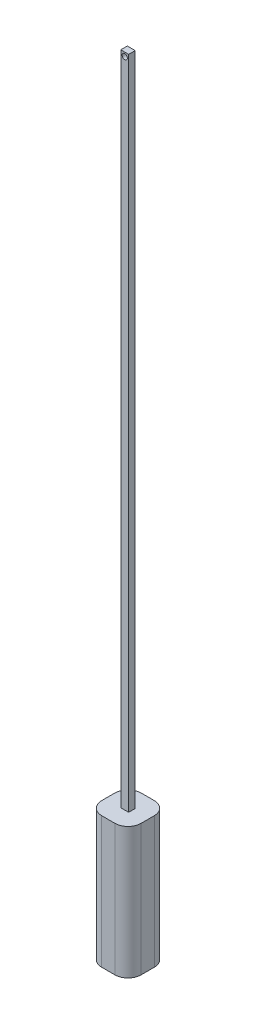
ISO-10303-21;
HEADER;
FILE_DESCRIPTION(('STEP AP214'),'2;1');
FILE_NAME('part.step','',(''),(''),'','','');
FILE_SCHEMA(('AUTOMOTIVE_DESIGN { 1 0 10303 214 1 1 1 1 }'));
ENDSEC;
DATA;
#1=APPLICATION_CONTEXT('core data for automotive mechanical design processes');
#2=APPLICATION_PROTOCOL_DEFINITION('international standard','automotive_design',2000,#1);
#3=PRODUCT_CONTEXT('',#1,'mechanical');
#4=PRODUCT('Part','Part','',(#3));
#5=PRODUCT_RELATED_PRODUCT_CATEGORY('part','',(#4));
#6=PRODUCT_DEFINITION_FORMATION('','',#4);
#7=PRODUCT_DEFINITION_CONTEXT('part definition',#1,'design');
#8=PRODUCT_DEFINITION('design','',#6,#7);
#9=PRODUCT_DEFINITION_SHAPE('','',#8);
#10=(LENGTH_UNIT() NAMED_UNIT(*) SI_UNIT(.MILLI.,.METRE.));
#11=(NAMED_UNIT(*) PLANE_ANGLE_UNIT() SI_UNIT($,.RADIAN.));
#12=(NAMED_UNIT(*) SI_UNIT($,.STERADIAN.) SOLID_ANGLE_UNIT());
#13=UNCERTAINTY_MEASURE_WITH_UNIT(LENGTH_MEASURE(1.E-05),#10,'distance_accuracy_value','');
#14=(GEOMETRIC_REPRESENTATION_CONTEXT(3) GLOBAL_UNCERTAINTY_ASSIGNED_CONTEXT((#13)) GLOBAL_UNIT_ASSIGNED_CONTEXT((#10,
#11,#12)) REPRESENTATION_CONTEXT('',''));
#15=CARTESIAN_POINT('',(0.,0.,0.));
#16=DIRECTION('',(0.,0.,1.));
#17=DIRECTION('',(1.,0.,0.));
#18=AXIS2_PLACEMENT_3D('',#15,#16,#17);
#19=CARTESIAN_POINT('',(0.,0.,5.));
#20=DIRECTION('',(0.,0.,1.));
#21=DIRECTION('',(1.,0.,0.));
#22=AXIS2_PLACEMENT_3D('',#19,#20,#21);
#23=PLANE('',#22);
#24=DIRECTION('',(0.,-1.,0.));
#25=VECTOR('',#24,1.);
#26=CARTESIAN_POINT('',(-3.,3.,5.));
#27=LINE('',#26,#25);
#28=CARTESIAN_POINT('',(-3.,3.,5.));
#29=VERTEX_POINT('',#28);
#30=CARTESIAN_POINT('',(-3.,-497.,5.));
#31=VERTEX_POINT('',#30);
#32=EDGE_CURVE('E141',#29,#31,#27,.T.);
#33=ORIENTED_EDGE('',*,*,#32,.T.);
#34=DIRECTION('',(1.,0.,0.));
#35=VECTOR('',#34,1.);
#36=CARTESIAN_POINT('',(-2.99999999999994,-497.,5.));
#37=LINE('',#36,#35);
#38=CARTESIAN_POINT('',(3.00000000000006,-497.,5.));
#39=VERTEX_POINT('',#38);
#40=EDGE_CURVE('E126',#31,#39,#37,.T.);
#41=ORIENTED_EDGE('',*,*,#40,.T.);
#42=DIRECTION('',(0.,1.,0.));
#43=VECTOR('',#42,1.);
#44=CARTESIAN_POINT('',(3.,3.,5.));
#45=LINE('',#44,#43);
#46=CARTESIAN_POINT('',(3.,3.,5.));
#47=VERTEX_POINT('',#46);
#48=EDGE_CURVE('E138',#39,#47,#45,.T.);
#49=ORIENTED_EDGE('',*,*,#48,.T.);
#50=DIRECTION('',(-1.,0.,0.));
#51=VECTOR('',#50,1.);
#52=CARTESIAN_POINT('',(-3.,3.,5.));
#53=LINE('',#52,#51);
#54=EDGE_CURVE('E147',#47,#29,#53,.T.);
#55=ORIENTED_EDGE('',*,*,#54,.T.);
#56=EDGE_LOOP('',(#33,#41,#49,#55));
#57=FACE_BOUND('',#56,.T.);
#58=CARTESIAN_POINT('',(0.,0.,5.));
#59=DIRECTION('',(0.,0.,1.));
#60=DIRECTION('',(1.,0.,0.));
#61=AXIS2_PLACEMENT_3D('',#58,#59,#60);
#62=CIRCLE('',#61,2.);
#63=CARTESIAN_POINT('',(2.,0.,5.));
#64=VERTEX_POINT('',#63);
#65=EDGE_CURVE('E156',#64,#64,#62,.T.);
#66=ORIENTED_EDGE('',*,*,#65,.F.);
#67=EDGE_LOOP('',(#66));
#68=FACE_BOUND('',#67,.T.);
#69=ADVANCED_FACE('F34',(#57,#68),#23,.T.);
#70=CARTESIAN_POINT('',(0.,0.,0.));
#71=DIRECTION('',(0.,0.,1.));
#72=DIRECTION('',(1.,0.,0.));
#73=AXIS2_PLACEMENT_3D('',#70,#71,#72);
#74=PLANE('',#73);
#75=DIRECTION('',(0.,-1.,0.));
#76=VECTOR('',#75,1.);
#77=CARTESIAN_POINT('',(-3.,3.,0.));
#78=LINE('',#77,#76);
#79=CARTESIAN_POINT('',(-3.,3.,0.));
#80=VERTEX_POINT('',#79);
#81=CARTESIAN_POINT('',(-3.,-497.,0.));
#82=VERTEX_POINT('',#81);
#83=EDGE_CURVE('E153',#80,#82,#78,.T.);
#84=ORIENTED_EDGE('',*,*,#83,.F.);
#85=DIRECTION('',(-1.,0.,0.));
#86=VECTOR('',#85,1.);
#87=CARTESIAN_POINT('',(-3.,3.,0.));
#88=LINE('',#87,#86);
#89=CARTESIAN_POINT('',(3.,3.,0.));
#90=VERTEX_POINT('',#89);
#91=EDGE_CURVE('E160',#90,#80,#88,.T.);
#92=ORIENTED_EDGE('',*,*,#91,.F.);
#93=DIRECTION('',(0.,1.,0.));
#94=VECTOR('',#93,1.);
#95=CARTESIAN_POINT('',(3.,3.,0.));
#96=LINE('',#95,#94);
#97=CARTESIAN_POINT('',(3.00000000000006,-497.,0.));
#98=VERTEX_POINT('',#97);
#99=EDGE_CURVE('E158',#98,#90,#96,.T.);
#100=ORIENTED_EDGE('',*,*,#99,.F.);
#101=DIRECTION('',(1.,0.,0.));
#102=VECTOR('',#101,1.);
#103=CARTESIAN_POINT('',(-2.99999999999994,-497.,0.));
#104=LINE('',#103,#102);
#105=EDGE_CURVE('E129',#82,#98,#104,.T.);
#106=ORIENTED_EDGE('',*,*,#105,.F.);
#107=EDGE_LOOP('',(#84,#92,#100,#106));
#108=FACE_BOUND('',#107,.T.);
#109=CARTESIAN_POINT('',(0.,0.,0.));
#110=DIRECTION('',(0.,0.,1.));
#111=DIRECTION('',(1.,0.,0.));
#112=AXIS2_PLACEMENT_3D('',#109,#110,#111);
#113=CIRCLE('',#112,2.);
#114=CARTESIAN_POINT('',(2.,0.,0.));
#115=VERTEX_POINT('',#114);
#116=EDGE_CURVE('E224',#115,#115,#113,.T.);
#117=ORIENTED_EDGE('',*,*,#116,.T.);
#118=EDGE_LOOP('',(#117));
#119=FACE_BOUND('',#118,.T.);
#120=ADVANCED_FACE('F264',(#108,#119),#74,.F.);
#121=CARTESIAN_POINT('',(-3.,3.,5.));
#122=DIRECTION('',(1.,0.,0.));
#123=DIRECTION('',(0.,1.,0.));
#124=AXIS2_PLACEMENT_3D('',#121,#122,#123);
#125=PLANE('',#124);
#126=ORIENTED_EDGE('',*,*,#83,.T.);
#127=DIRECTION('',(0.,0.,-1.));
#128=VECTOR('',#127,1.);
#129=CARTESIAN_POINT('',(-2.99999999999994,-497.,5.));
#130=LINE('',#129,#128);
#131=EDGE_CURVE('E133',#31,#82,#130,.T.);
#132=ORIENTED_EDGE('',*,*,#131,.F.);
#133=ORIENTED_EDGE('',*,*,#32,.F.);
#134=DIRECTION('',(0.,0.,-1.));
#135=VECTOR('',#134,1.);
#136=CARTESIAN_POINT('',(-3.,3.,5.));
#137=LINE('',#136,#135);
#138=EDGE_CURVE('E149',#29,#80,#137,.T.);
#139=ORIENTED_EDGE('',*,*,#138,.T.);
#140=EDGE_LOOP('',(#126,#132,#133,#139));
#141=FACE_BOUND('',#140,.T.);
#142=ADVANCED_FACE('F269',(#141),#125,.F.);
#143=CARTESIAN_POINT('',(3.,3.,5.));
#144=DIRECTION('',(-1.,0.,0.));
#145=DIRECTION('',(0.,-1.,0.));
#146=AXIS2_PLACEMENT_3D('',#143,#144,#145);
#147=PLANE('',#146);
#148=ORIENTED_EDGE('',*,*,#99,.T.);
#149=DIRECTION('',(0.,0.,-1.));
#150=VECTOR('',#149,1.);
#151=CARTESIAN_POINT('',(3.,3.,5.));
#152=LINE('',#151,#150);
#153=EDGE_CURVE('E134',#47,#90,#152,.T.);
#154=ORIENTED_EDGE('',*,*,#153,.F.);
#155=ORIENTED_EDGE('',*,*,#48,.F.);
#156=DIRECTION('',(0.,0.,-1.));
#157=VECTOR('',#156,1.);
#158=CARTESIAN_POINT('',(3.00000000000006,-497.,5.));
#159=LINE('',#158,#157);
#160=EDGE_CURVE('E123',#39,#98,#159,.T.);
#161=ORIENTED_EDGE('',*,*,#160,.T.);
#162=EDGE_LOOP('',(#148,#154,#155,#161));
#163=FACE_BOUND('',#162,.T.);
#164=ADVANCED_FACE('F144',(#163),#147,.F.);
#165=CARTESIAN_POINT('',(-3.,3.,5.));
#166=DIRECTION('',(0.,-1.,0.));
#167=DIRECTION('',(1.,0.,0.));
#168=AXIS2_PLACEMENT_3D('',#165,#166,#167);
#169=PLANE('',#168);
#170=ORIENTED_EDGE('',*,*,#91,.T.);
#171=ORIENTED_EDGE('',*,*,#138,.F.);
#172=ORIENTED_EDGE('',*,*,#54,.F.);
#173=ORIENTED_EDGE('',*,*,#153,.T.);
#174=EDGE_LOOP('',(#170,#171,#172,#173));
#175=FACE_BOUND('',#174,.T.);
#176=ADVANCED_FACE('F276',(#175),#169,.F.);
#177=CARTESIAN_POINT('',(0.,0.,5.));
#178=DIRECTION('',(0.,0.,-1.));
#179=DIRECTION('',(-1.,0.,0.));
#180=AXIS2_PLACEMENT_3D('',#177,#178,#179);
#181=CYLINDRICAL_SURFACE('',#180,2.);
#182=ORIENTED_EDGE('',*,*,#65,.T.);
#183=EDGE_LOOP('',(#182));
#184=FACE_BOUND('',#183,.T.);
#185=ORIENTED_EDGE('',*,*,#116,.F.);
#186=EDGE_LOOP('',(#185));
#187=FACE_BOUND('',#186,.T.);
#188=ADVANCED_FACE('F273',(#184,#187),#181,.F.);
#189=CARTESIAN_POINT('',(0.,-497.,0.));
#190=DIRECTION('',(0.,-1.,0.));
#191=DIRECTION('',(0.,0.,-1.));
#192=AXIS2_PLACEMENT_3D('',#189,#190,#191);
#193=PLANE('',#192);
#194=DIRECTION('',(1.,0.,0.));
#195=VECTOR('',#194,1.);
#196=CARTESIAN_POINT('',(-14.9999999999999,-497.,-12.5));
#197=LINE('',#196,#195);
#198=CARTESIAN_POINT('',(-4.99999999999994,-497.,-12.5));
#199=VERTEX_POINT('',#198);
#200=CARTESIAN_POINT('',(5.00000000000006,-497.,-12.5));
#201=VERTEX_POINT('',#200);
#202=EDGE_CURVE('E220',#199,#201,#197,.T.);
#203=ORIENTED_EDGE('',*,*,#202,.F.);
#204=CARTESIAN_POINT('',(-4.99999999999994,-497.,-2.5));
#205=DIRECTION('',(0.,-1.,0.));
#206=DIRECTION('',(0.,0.,-1.));
#207=AXIS2_PLACEMENT_3D('',#204,#205,#206);
#208=CIRCLE('',#207,10.);
#209=CARTESIAN_POINT('',(-14.9999999999999,-497.,-2.5));
#210=VERTEX_POINT('',#209);
#211=EDGE_CURVE('E177',#199,#210,#208,.F.);
#212=ORIENTED_EDGE('',*,*,#211,.T.);
#213=DIRECTION('',(0.,0.,-1.));
#214=VECTOR('',#213,1.);
#215=CARTESIAN_POINT('',(-14.9999999999999,-497.,17.5));
#216=LINE('',#215,#214);
#217=CARTESIAN_POINT('',(-14.9999999999999,-497.,7.5));
#218=VERTEX_POINT('',#217);
#219=EDGE_CURVE('E212',#218,#210,#216,.T.);
#220=ORIENTED_EDGE('',*,*,#219,.F.);
#221=CARTESIAN_POINT('',(-4.99999999999994,-497.,7.49999999999999));
#222=DIRECTION('',(0.,-1.,0.));
#223=DIRECTION('',(0.,0.,-1.));
#224=AXIS2_PLACEMENT_3D('',#221,#222,#223);
#225=CIRCLE('',#224,10.);
#226=CARTESIAN_POINT('',(-4.99999999999994,-497.,17.5));
#227=VERTEX_POINT('',#226);
#228=EDGE_CURVE('E171',#218,#227,#225,.F.);
#229=ORIENTED_EDGE('',*,*,#228,.T.);
#230=DIRECTION('',(-1.,0.,0.));
#231=VECTOR('',#230,1.);
#232=CARTESIAN_POINT('',(-14.9999999999999,-497.,17.5));
#233=LINE('',#232,#231);
#234=CARTESIAN_POINT('',(5.00000000000006,-497.,17.5));
#235=VERTEX_POINT('',#234);
#236=EDGE_CURVE('E210',#235,#227,#233,.T.);
#237=ORIENTED_EDGE('',*,*,#236,.F.);
#238=CARTESIAN_POINT('',(5.00000000000006,-497.,7.49999999999999));
#239=DIRECTION('',(0.,-1.,0.));
#240=DIRECTION('',(0.,0.,-1.));
#241=AXIS2_PLACEMENT_3D('',#238,#239,#240);
#242=CIRCLE('',#241,10.);
#243=CARTESIAN_POINT('',(15.0000000000001,-497.,7.5));
#244=VERTEX_POINT('',#243);
#245=EDGE_CURVE('E173',#235,#244,#242,.F.);
#246=ORIENTED_EDGE('',*,*,#245,.T.);
#247=DIRECTION('',(0.,0.,1.));
#248=VECTOR('',#247,1.);
#249=CARTESIAN_POINT('',(15.0000000000001,-497.,17.5));
#250=LINE('',#249,#248);
#251=CARTESIAN_POINT('',(15.0000000000001,-497.,-2.5));
#252=VERTEX_POINT('',#251);
#253=EDGE_CURVE('E201',#252,#244,#250,.T.);
#254=ORIENTED_EDGE('',*,*,#253,.F.);
#255=CARTESIAN_POINT('',(5.00000000000006,-497.,-2.5));
#256=DIRECTION('',(0.,-1.,0.));
#257=DIRECTION('',(0.,0.,-1.));
#258=AXIS2_PLACEMENT_3D('',#255,#256,#257);
#259=CIRCLE('',#258,10.);
#260=EDGE_CURVE('E175',#252,#201,#259,.F.);
#261=ORIENTED_EDGE('',*,*,#260,.T.);
#262=EDGE_LOOP('',(#203,#212,#220,#229,#237,#246,#254,#261));
#263=FACE_BOUND('',#262,.T.);
#264=ORIENTED_EDGE('',*,*,#40,.F.);
#265=ORIENTED_EDGE('',*,*,#131,.T.);
#266=ORIENTED_EDGE('',*,*,#105,.T.);
#267=ORIENTED_EDGE('',*,*,#160,.F.);
#268=EDGE_LOOP('',(#264,#265,#266,#267));
#269=FACE_BOUND('',#268,.T.);
#270=ADVANCED_FACE('F125',(#263,#269),#193,.F.);
#271=CARTESIAN_POINT('',(15.0000000000001,-597.,17.5));
#272=DIRECTION('',(-1.,0.,0.));
#273=DIRECTION('',(0.,0.,1.));
#274=AXIS2_PLACEMENT_3D('',#271,#272,#273);
#275=PLANE('',#274);
#276=DIRECTION('',(0.,0.,1.));
#277=VECTOR('',#276,1.);
#278=CARTESIAN_POINT('',(15.0000000000001,-597.,17.5));
#279=LINE('',#278,#277);
#280=CARTESIAN_POINT('',(15.0000000000001,-597.,-2.5));
#281=VERTEX_POINT('',#280);
#282=CARTESIAN_POINT('',(15.0000000000001,-597.,7.5));
#283=VERTEX_POINT('',#282);
#284=EDGE_CURVE('E203',#281,#283,#279,.T.);
#285=ORIENTED_EDGE('',*,*,#284,.F.);
#286=DIRECTION('',(0.,1.,0.));
#287=VECTOR('',#286,1.);
#288=CARTESIAN_POINT('',(15.0000000000001,-597.,-2.5));
#289=LINE('',#288,#287);
#290=EDGE_CURVE('E193',#281,#252,#289,.T.);
#291=ORIENTED_EDGE('',*,*,#290,.T.);
#292=ORIENTED_EDGE('',*,*,#253,.T.);
#293=DIRECTION('',(0.,1.,0.));
#294=VECTOR('',#293,1.);
#295=CARTESIAN_POINT('',(15.0000000000001,-597.,7.5));
#296=LINE('',#295,#294);
#297=EDGE_CURVE('E191',#244,#283,#296,.F.);
#298=ORIENTED_EDGE('',*,*,#297,.T.);
#299=EDGE_LOOP('',(#285,#291,#292,#298));
#300=FACE_BOUND('',#299,.T.);
#301=ADVANCED_FACE('F200',(#300),#275,.F.);
#302=CARTESIAN_POINT('',(-14.9999999999999,-597.,17.5));
#303=DIRECTION('',(0.,0.,-1.));
#304=DIRECTION('',(-1.,0.,0.));
#305=AXIS2_PLACEMENT_3D('',#302,#303,#304);
#306=PLANE('',#305);
#307=DIRECTION('',(-1.,0.,0.));
#308=VECTOR('',#307,1.);
#309=CARTESIAN_POINT('',(-14.9999999999999,-597.,17.5));
#310=LINE('',#309,#308);
#311=CARTESIAN_POINT('',(5.00000000000006,-597.,17.5));
#312=VERTEX_POINT('',#311);
#313=CARTESIAN_POINT('',(-4.99999999999994,-597.,17.5));
#314=VERTEX_POINT('',#313);
#315=EDGE_CURVE('E232',#312,#314,#310,.T.);
#316=ORIENTED_EDGE('',*,*,#315,.F.);
#317=DIRECTION('',(0.,1.,0.));
#318=VECTOR('',#317,1.);
#319=CARTESIAN_POINT('',(5.00000000000006,-597.,17.5));
#320=LINE('',#319,#318);
#321=EDGE_CURVE('E11',#312,#235,#320,.T.);
#322=ORIENTED_EDGE('',*,*,#321,.T.);
#323=ORIENTED_EDGE('',*,*,#236,.T.);
#324=DIRECTION('',(0.,1.,0.));
#325=VECTOR('',#324,1.);
#326=CARTESIAN_POINT('',(-4.99999999999994,-597.,17.5));
#327=LINE('',#326,#325);
#328=EDGE_CURVE('E42',#227,#314,#327,.F.);
#329=ORIENTED_EDGE('',*,*,#328,.T.);
#330=EDGE_LOOP('',(#316,#322,#323,#329));
#331=FACE_BOUND('',#330,.T.);
#332=ADVANCED_FACE('F241',(#331),#306,.F.);
#333=CARTESIAN_POINT('',(-14.9999999999999,-597.,17.5));
#334=DIRECTION('',(1.,0.,0.));
#335=DIRECTION('',(0.,0.,-1.));
#336=AXIS2_PLACEMENT_3D('',#333,#334,#335);
#337=PLANE('',#336);
#338=ORIENTED_EDGE('',*,*,#219,.T.);
#339=DIRECTION('',(0.,1.,0.));
#340=VECTOR('',#339,1.);
#341=CARTESIAN_POINT('',(-14.9999999999999,-597.,-2.5));
#342=LINE('',#341,#340);
#343=CARTESIAN_POINT('',(-14.9999999999999,-597.,-2.5));
#344=VERTEX_POINT('',#343);
#345=EDGE_CURVE('E182',#210,#344,#342,.F.);
#346=ORIENTED_EDGE('',*,*,#345,.T.);
#347=DIRECTION('',(0.,0.,-1.));
#348=VECTOR('',#347,1.);
#349=CARTESIAN_POINT('',(-14.9999999999999,-597.,17.5));
#350=LINE('',#349,#348);
#351=CARTESIAN_POINT('',(-14.9999999999999,-597.,7.5));
#352=VERTEX_POINT('',#351);
#353=EDGE_CURVE('E229',#352,#344,#350,.T.);
#354=ORIENTED_EDGE('',*,*,#353,.F.);
#355=DIRECTION('',(0.,1.,0.));
#356=VECTOR('',#355,1.);
#357=CARTESIAN_POINT('',(-14.9999999999999,-597.,7.49999999999999));
#358=LINE('',#357,#356);
#359=EDGE_CURVE('E179',#352,#218,#358,.T.);
#360=ORIENTED_EDGE('',*,*,#359,.T.);
#361=EDGE_LOOP('',(#338,#346,#354,#360));
#362=FACE_BOUND('',#361,.T.);
#363=ADVANCED_FACE('F247',(#362),#337,.F.);
#364=CARTESIAN_POINT('',(-14.9999999999999,-597.,-12.5));
#365=DIRECTION('',(0.,0.,1.));
#366=DIRECTION('',(1.,0.,0.));
#367=AXIS2_PLACEMENT_3D('',#364,#365,#366);
#368=PLANE('',#367);
#369=DIRECTION('',(1.,0.,0.));
#370=VECTOR('',#369,1.);
#371=CARTESIAN_POINT('',(-14.9999999999999,-597.,-12.5));
#372=LINE('',#371,#370);
#373=CARTESIAN_POINT('',(-4.99999999999994,-597.,-12.5));
#374=VERTEX_POINT('',#373);
#375=CARTESIAN_POINT('',(5.00000000000006,-597.,-12.5));
#376=VERTEX_POINT('',#375);
#377=EDGE_CURVE('E215',#374,#376,#372,.T.);
#378=ORIENTED_EDGE('',*,*,#377,.F.);
#379=DIRECTION('',(0.,1.,0.));
#380=VECTOR('',#379,1.);
#381=CARTESIAN_POINT('',(-4.99999999999994,-597.,-12.5));
#382=LINE('',#381,#380);
#383=EDGE_CURVE('E168',#374,#199,#382,.T.);
#384=ORIENTED_EDGE('',*,*,#383,.T.);
#385=ORIENTED_EDGE('',*,*,#202,.T.);
#386=DIRECTION('',(0.,1.,0.));
#387=VECTOR('',#386,1.);
#388=CARTESIAN_POINT('',(5.00000000000006,-597.,-12.5));
#389=LINE('',#388,#387);
#390=EDGE_CURVE('E166',#201,#376,#389,.F.);
#391=ORIENTED_EDGE('',*,*,#390,.T.);
#392=EDGE_LOOP('',(#378,#384,#385,#391));
#393=FACE_BOUND('',#392,.T.);
#394=ADVANCED_FACE('F253',(#393),#368,.F.);
#395=CARTESIAN_POINT('',(0.,-597.,0.));
#396=DIRECTION('',(0.,-1.,0.));
#397=DIRECTION('',(0.,0.,-1.));
#398=AXIS2_PLACEMENT_3D('',#395,#396,#397);
#399=PLANE('',#398);
#400=ORIENTED_EDGE('',*,*,#353,.T.);
#401=CARTESIAN_POINT('',(-4.99999999999994,-597.,-2.5));
#402=DIRECTION('',(0.,-1.,0.));
#403=DIRECTION('',(0.,0.,-1.));
#404=AXIS2_PLACEMENT_3D('',#401,#402,#403);
#405=CIRCLE('',#404,10.);
#406=EDGE_CURVE('E189',#344,#374,#405,.T.);
#407=ORIENTED_EDGE('',*,*,#406,.T.);
#408=ORIENTED_EDGE('',*,*,#377,.T.);
#409=CARTESIAN_POINT('',(5.00000000000006,-597.,-2.5));
#410=DIRECTION('',(0.,-1.,0.));
#411=DIRECTION('',(0.,0.,-1.));
#412=AXIS2_PLACEMENT_3D('',#409,#410,#411);
#413=CIRCLE('',#412,10.);
#414=EDGE_CURVE('E187',#376,#281,#413,.T.);
#415=ORIENTED_EDGE('',*,*,#414,.T.);
#416=ORIENTED_EDGE('',*,*,#284,.T.);
#417=CARTESIAN_POINT('',(5.00000000000006,-597.,7.49999999999999));
#418=DIRECTION('',(0.,-1.,0.));
#419=DIRECTION('',(0.,0.,-1.));
#420=AXIS2_PLACEMENT_3D('',#417,#418,#419);
#421=CIRCLE('',#420,10.);
#422=EDGE_CURVE('E55',#283,#312,#421,.T.);
#423=ORIENTED_EDGE('',*,*,#422,.T.);
#424=ORIENTED_EDGE('',*,*,#315,.T.);
#425=CARTESIAN_POINT('',(-4.99999999999994,-597.,7.49999999999999));
#426=DIRECTION('',(0.,-1.,0.));
#427=DIRECTION('',(0.,0.,-1.));
#428=AXIS2_PLACEMENT_3D('',#425,#426,#427);
#429=CIRCLE('',#428,10.);
#430=EDGE_CURVE('E184',#314,#352,#429,.T.);
#431=ORIENTED_EDGE('',*,*,#430,.T.);
#432=EDGE_LOOP('',(#400,#407,#408,#415,#416,#423,#424,#431));
#433=FACE_BOUND('',#432,.T.);
#434=ADVANCED_FACE('F237',(#433),#399,.T.);
#435=CARTESIAN_POINT('',(-4.99999999999994,-597.,-2.5));
#436=DIRECTION('',(0.,1.,0.));
#437=DIRECTION('',(0.,0.,1.));
#438=AXIS2_PLACEMENT_3D('',#435,#436,#437);
#439=CYLINDRICAL_SURFACE('',#438,10.);
#440=ORIENTED_EDGE('',*,*,#406,.F.);
#441=ORIENTED_EDGE('',*,*,#345,.F.);
#442=ORIENTED_EDGE('',*,*,#211,.F.);
#443=ORIENTED_EDGE('',*,*,#383,.F.);
#444=EDGE_LOOP('',(#440,#441,#442,#443));
#445=FACE_BOUND('',#444,.T.);
#446=ADVANCED_FACE('F250',(#445),#439,.T.);
#447=CARTESIAN_POINT('',(5.00000000000006,-597.,-2.5));
#448=DIRECTION('',(0.,1.,0.));
#449=DIRECTION('',(0.,0.,1.));
#450=AXIS2_PLACEMENT_3D('',#447,#448,#449);
#451=CYLINDRICAL_SURFACE('',#450,10.);
#452=ORIENTED_EDGE('',*,*,#414,.F.);
#453=ORIENTED_EDGE('',*,*,#390,.F.);
#454=ORIENTED_EDGE('',*,*,#260,.F.);
#455=ORIENTED_EDGE('',*,*,#290,.F.);
#456=EDGE_LOOP('',(#452,#453,#454,#455));
#457=FACE_BOUND('',#456,.T.);
#458=ADVANCED_FACE('F255',(#457),#451,.T.);
#459=CARTESIAN_POINT('',(5.00000000000006,-597.,7.49999999999999));
#460=DIRECTION('',(0.,1.,0.));
#461=DIRECTION('',(0.,0.,1.));
#462=AXIS2_PLACEMENT_3D('',#459,#460,#461);
#463=CYLINDRICAL_SURFACE('',#462,10.);
#464=ORIENTED_EDGE('',*,*,#422,.F.);
#465=ORIENTED_EDGE('',*,*,#297,.F.);
#466=ORIENTED_EDGE('',*,*,#245,.F.);
#467=ORIENTED_EDGE('',*,*,#321,.F.);
#468=EDGE_LOOP('',(#464,#465,#466,#467));
#469=FACE_BOUND('',#468,.T.);
#470=ADVANCED_FACE('F240',(#469),#463,.T.);
#471=CARTESIAN_POINT('',(-4.99999999999994,-597.,7.49999999999999));
#472=DIRECTION('',(0.,1.,0.));
#473=DIRECTION('',(0.,0.,1.));
#474=AXIS2_PLACEMENT_3D('',#471,#472,#473);
#475=CYLINDRICAL_SURFACE('',#474,10.);
#476=ORIENTED_EDGE('',*,*,#430,.F.);
#477=ORIENTED_EDGE('',*,*,#328,.F.);
#478=ORIENTED_EDGE('',*,*,#228,.F.);
#479=ORIENTED_EDGE('',*,*,#359,.F.);
#480=EDGE_LOOP('',(#476,#477,#478,#479));
#481=FACE_BOUND('',#480,.T.);
#482=ADVANCED_FACE('F36',(#481),#475,.T.);
#483=CLOSED_SHELL('',(#69,#120,#142,#164,#176,#188,#270,#301,#332,#363,#394,#434,#446,#458,#470,#482));
#484=MANIFOLD_SOLID_BREP('B2',#483);
#485=ADVANCED_BREP_SHAPE_REPRESENTATION('',(#18,#484),#14);
#486=SHAPE_DEFINITION_REPRESENTATION(#9,#485);
ENDSEC;
END-ISO-10303-21;
